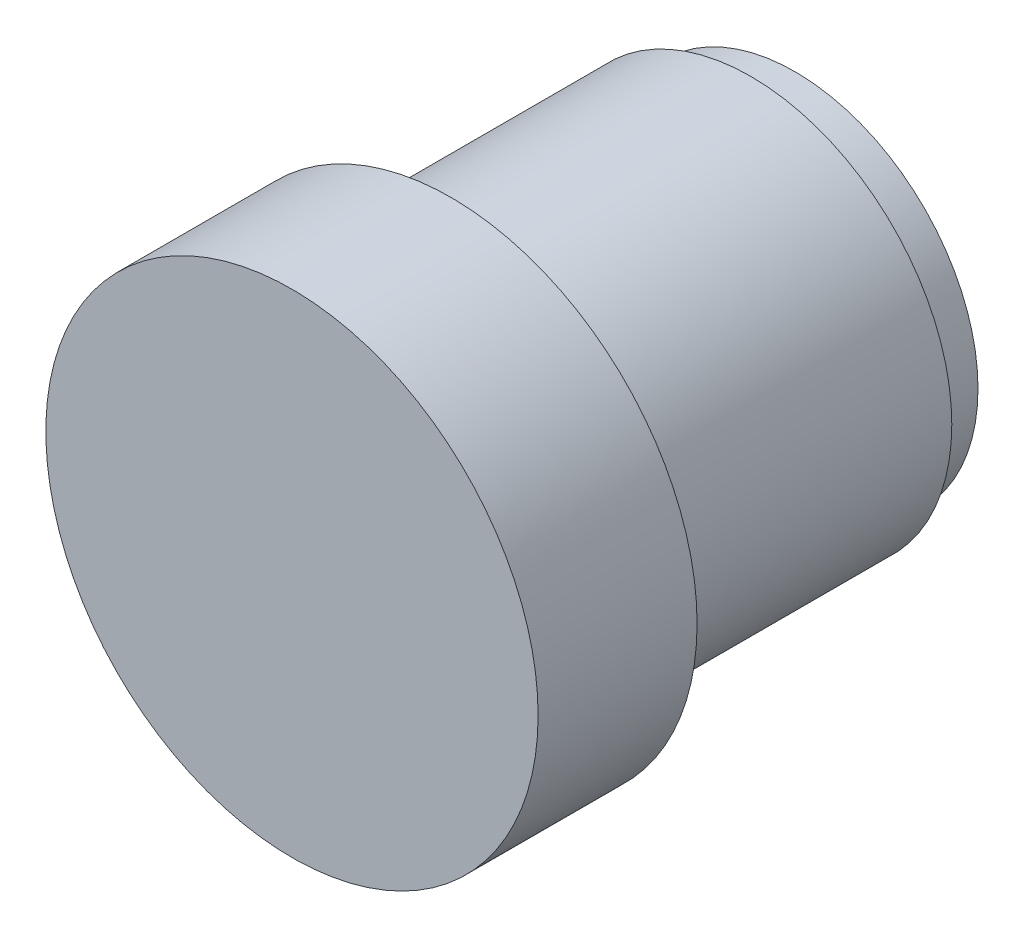
ISO-10303-21;
HEADER;
FILE_DESCRIPTION(('STEP AP214'),'2;1');
FILE_NAME('part.step','',(''),(''),'','','');
FILE_SCHEMA(('AUTOMOTIVE_DESIGN { 1 0 10303 214 1 1 1 1 }'));
ENDSEC;
DATA;
#1=APPLICATION_CONTEXT('core data for automotive mechanical design processes');
#2=APPLICATION_PROTOCOL_DEFINITION('international standard','automotive_design',2000,#1);
#3=PRODUCT_CONTEXT('',#1,'mechanical');
#4=PRODUCT('Part','Part','',(#3));
#5=PRODUCT_RELATED_PRODUCT_CATEGORY('part','',(#4));
#6=PRODUCT_DEFINITION_FORMATION('','',#4);
#7=PRODUCT_DEFINITION_CONTEXT('part definition',#1,'design');
#8=PRODUCT_DEFINITION('design','',#6,#7);
#9=PRODUCT_DEFINITION_SHAPE('','',#8);
#10=(LENGTH_UNIT() NAMED_UNIT(*) SI_UNIT(.MILLI.,.METRE.));
#11=(NAMED_UNIT(*) PLANE_ANGLE_UNIT() SI_UNIT($,.RADIAN.));
#12=(NAMED_UNIT(*) SI_UNIT($,.STERADIAN.) SOLID_ANGLE_UNIT());
#13=UNCERTAINTY_MEASURE_WITH_UNIT(LENGTH_MEASURE(1.E-05),#10,'distance_accuracy_value','');
#14=(GEOMETRIC_REPRESENTATION_CONTEXT(3) GLOBAL_UNCERTAINTY_ASSIGNED_CONTEXT((#13)) GLOBAL_UNIT_ASSIGNED_CONTEXT((#10,
#11,#12)) REPRESENTATION_CONTEXT('',''));
#15=CARTESIAN_POINT('',(0.,0.,0.));
#16=DIRECTION('',(0.,0.,1.));
#17=DIRECTION('',(1.,0.,0.));
#18=AXIS2_PLACEMENT_3D('',#15,#16,#17);
#19=CARTESIAN_POINT('',(0.,0.,4.9));
#20=DIRECTION('',(0.,0.,-1.));
#21=DIRECTION('',(-1.,0.,0.));
#22=AXIS2_PLACEMENT_3D('',#19,#20,#21);
#23=CYLINDRICAL_SURFACE('',#22,20.25);
#24=CARTESIAN_POINT('',(0.,0.,4.9));
#25=DIRECTION('',(0.,0.,1.));
#26=DIRECTION('',(1.,0.,0.));
#27=AXIS2_PLACEMENT_3D('',#24,#25,#26);
#28=CIRCLE('',#27,20.25);
#29=CARTESIAN_POINT('',(20.25,0.,4.9));
#30=VERTEX_POINT('',#29);
#31=EDGE_CURVE('E10',#30,#30,#28,.T.);
#32=ORIENTED_EDGE('',*,*,#31,.F.);
#33=EDGE_LOOP('',(#32));
#34=FACE_BOUND('',#33,.T.);
#35=CARTESIAN_POINT('',(0.,0.,0.));
#36=DIRECTION('',(0.,0.,1.));
#37=DIRECTION('',(1.,0.,0.));
#38=AXIS2_PLACEMENT_3D('',#35,#36,#37);
#39=CIRCLE('',#38,20.25);
#40=CARTESIAN_POINT('',(20.25,0.,0.));
#41=VERTEX_POINT('',#40);
#42=EDGE_CURVE('E35',#41,#41,#39,.T.);
#43=ORIENTED_EDGE('',*,*,#42,.T.);
#44=EDGE_LOOP('',(#43));
#45=FACE_BOUND('',#44,.T.);
#46=ADVANCED_FACE('F32',(#34,#45),#23,.T.);
#47=CARTESIAN_POINT('',(0.,0.,0.));
#48=DIRECTION('',(0.,0.,1.));
#49=DIRECTION('',(1.,0.,0.));
#50=AXIS2_PLACEMENT_3D('',#47,#48,#49);
#51=PLANE('',#50);
#52=CARTESIAN_POINT('',(0.,0.,0.));
#53=DIRECTION('',(0.,0.,-1.));
#54=DIRECTION('',(-1.,0.,0.));
#55=AXIS2_PLACEMENT_3D('',#52,#53,#54);
#56=CIRCLE('',#55,19.25);
#57=CARTESIAN_POINT('',(-19.25,0.,0.));
#58=VERTEX_POINT('',#57);
#59=EDGE_CURVE('E47',#58,#58,#56,.T.);
#60=ORIENTED_EDGE('',*,*,#59,.F.);
#61=EDGE_LOOP('',(#60));
#62=FACE_BOUND('',#61,.T.);
#63=ORIENTED_EDGE('',*,*,#42,.F.);
#64=EDGE_LOOP('',(#63));
#65=FACE_BOUND('',#64,.T.);
#66=ADVANCED_FACE('F86',(#62,#65),#51,.F.);
#67=CARTESIAN_POINT('',(0.,0.,4.9));
#68=DIRECTION('',(0.,0.,1.));
#69=DIRECTION('',(1.,0.,0.));
#70=AXIS2_PLACEMENT_3D('',#67,#68,#69);
#71=PLANE('',#70);
#72=CARTESIAN_POINT('',(0.,0.,4.9));
#73=DIRECTION('',(0.,0.,1.));
#74=DIRECTION('',(1.,0.,0.));
#75=AXIS2_PLACEMENT_3D('',#72,#73,#74);
#76=CIRCLE('',#75,22.25);
#77=CARTESIAN_POINT('',(-22.25,0.,4.9));
#78=VERTEX_POINT('',#77);
#79=EDGE_CURVE('E44',#78,#78,#76,.T.);
#80=ORIENTED_EDGE('',*,*,#79,.F.);
#81=EDGE_LOOP('',(#80));
#82=FACE_BOUND('',#81,.T.);
#83=ORIENTED_EDGE('',*,*,#31,.T.);
#84=EDGE_LOOP('',(#83));
#85=FACE_BOUND('',#84,.T.);
#86=ADVANCED_FACE('F81',(#82,#85),#71,.F.);
#87=CARTESIAN_POINT('',(0.,0.,38.1));
#88=DIRECTION('',(0.,0.,-1.));
#89=DIRECTION('',(-1.,0.,0.));
#90=AXIS2_PLACEMENT_3D('',#87,#88,#89);
#91=CYLINDRICAL_SURFACE('',#90,22.25);
#92=CARTESIAN_POINT('',(0.,0.,38.1));
#93=DIRECTION('',(0.,0.,1.));
#94=DIRECTION('',(1.,0.,0.));
#95=AXIS2_PLACEMENT_3D('',#92,#93,#94);
#96=CIRCLE('',#95,22.25);
#97=CARTESIAN_POINT('',(-22.25,0.,38.1));
#98=VERTEX_POINT('',#97);
#99=EDGE_CURVE('E42',#98,#98,#96,.T.);
#100=CARTESIAN_POINT('',(-22.25,0.,38.1));
#101=CARTESIAN_POINT('',(-22.25,0.,37.7541666666667));
#102=CARTESIAN_POINT('',(-22.25,0.,37.4083333333333));
#103=CARTESIAN_POINT('',(-22.25,0.,36.7166666666667));
#104=CARTESIAN_POINT('',(-22.25,0.,36.3708333333333));
#105=CARTESIAN_POINT('',(-22.25,0.,35.6791666666667));
#106=CARTESIAN_POINT('',(-22.25,0.,35.3333333333333));
#107=CARTESIAN_POINT('',(-22.25,0.,34.6416666666667));
#108=CARTESIAN_POINT('',(-22.25,0.,34.2958333333333));
#109=CARTESIAN_POINT('',(-22.25,0.,33.6041666666667));
#110=CARTESIAN_POINT('',(-22.25,0.,33.2583333333333));
#111=CARTESIAN_POINT('',(-22.25,0.,32.5666666666667));
#112=CARTESIAN_POINT('',(-22.25,0.,32.2208333333333));
#113=CARTESIAN_POINT('',(-22.25,0.,31.5291666666667));
#114=CARTESIAN_POINT('',(-22.25,0.,31.1833333333333));
#115=CARTESIAN_POINT('',(-22.25,0.,30.4916666666667));
#116=CARTESIAN_POINT('',(-22.25,0.,30.1458333333333));
#117=CARTESIAN_POINT('',(-22.25,0.,29.4541666666667));
#118=CARTESIAN_POINT('',(-22.25,0.,29.1083333333333));
#119=CARTESIAN_POINT('',(-22.25,0.,28.4166666666667));
#120=CARTESIAN_POINT('',(-22.25,0.,28.0708333333333));
#121=CARTESIAN_POINT('',(-22.25,0.,27.3791666666667));
#122=CARTESIAN_POINT('',(-22.25,0.,27.0333333333333));
#123=CARTESIAN_POINT('',(-22.25,0.,26.3416666666667));
#124=CARTESIAN_POINT('',(-22.25,0.,25.9958333333333));
#125=CARTESIAN_POINT('',(-22.25,0.,25.3041666666667));
#126=CARTESIAN_POINT('',(-22.25,0.,24.9583333333333));
#127=CARTESIAN_POINT('',(-22.25,0.,24.2666666666667));
#128=CARTESIAN_POINT('',(-22.25,0.,23.9208333333333));
#129=CARTESIAN_POINT('',(-22.25,0.,23.2291666666667));
#130=CARTESIAN_POINT('',(-22.25,0.,22.8833333333333));
#131=CARTESIAN_POINT('',(-22.25,0.,22.1916666666667));
#132=CARTESIAN_POINT('',(-22.25,0.,21.8458333333333));
#133=CARTESIAN_POINT('',(-22.25,0.,21.1541666666667));
#134=CARTESIAN_POINT('',(-22.25,0.,20.8083333333333));
#135=CARTESIAN_POINT('',(-22.25,0.,20.1166666666667));
#136=CARTESIAN_POINT('',(-22.25,0.,19.7708333333333));
#137=CARTESIAN_POINT('',(-22.25,0.,19.0791666666667));
#138=CARTESIAN_POINT('',(-22.25,0.,18.7333333333333));
#139=CARTESIAN_POINT('',(-22.25,0.,18.0416666666667));
#140=CARTESIAN_POINT('',(-22.25,0.,17.6958333333333));
#141=CARTESIAN_POINT('',(-22.25,0.,17.0041666666667));
#142=CARTESIAN_POINT('',(-22.25,0.,16.6583333333333));
#143=CARTESIAN_POINT('',(-22.25,0.,15.9666666666667));
#144=CARTESIAN_POINT('',(-22.25,0.,15.6208333333333));
#145=CARTESIAN_POINT('',(-22.25,0.,14.9291666666667));
#146=CARTESIAN_POINT('',(-22.25,0.,14.5833333333333));
#147=CARTESIAN_POINT('',(-22.25,0.,13.8916666666667));
#148=CARTESIAN_POINT('',(-22.25,0.,13.5458333333333));
#149=CARTESIAN_POINT('',(-22.25,0.,12.8541666666667));
#150=CARTESIAN_POINT('',(-22.25,0.,12.5083333333333));
#151=CARTESIAN_POINT('',(-22.25,0.,11.8166666666667));
#152=CARTESIAN_POINT('',(-22.25,0.,11.4708333333333));
#153=CARTESIAN_POINT('',(-22.25,0.,10.7791666666667));
#154=CARTESIAN_POINT('',(-22.25,0.,10.4333333333333));
#155=CARTESIAN_POINT('',(-22.25,0.,9.74166666666667));
#156=CARTESIAN_POINT('',(-22.25,0.,9.39583333333334));
#157=CARTESIAN_POINT('',(-22.25,0.,8.70416666666667));
#158=CARTESIAN_POINT('',(-22.25,0.,8.35833333333334));
#159=CARTESIAN_POINT('',(-22.25,0.,7.66666666666667));
#160=CARTESIAN_POINT('',(-22.25,0.,7.32083333333334));
#161=CARTESIAN_POINT('',(-22.25,0.,6.62916666666667));
#162=CARTESIAN_POINT('',(-22.25,0.,6.28333333333333));
#163=CARTESIAN_POINT('',(-22.25,0.,5.59166666666667));
#164=CARTESIAN_POINT('',(-22.25,0.,5.24583333333333));
#165=CARTESIAN_POINT('',(-22.25,0.,4.9));
#166=B_SPLINE_CURVE_WITH_KNOTS('',3,(#100,#101,#102,#103,#104,#105,#106,#107,#108,#109,#110,
#111,#112,#113,#114,#115,#116,#117,#118,#119,#120,#121,#122,#123,#124,#125,#126,#127,#128,#129,
#130,#131,#132,#133,#134,#135,#136,#137,#138,#139,#140,#141,#142,#143,#144,#145,#146,#147,#148,
#149,#150,#151,#152,#153,#154,#155,#156,#157,#158,#159,#160,#161,#162,#163,#164,#165),
.UNSPECIFIED.,.F.,.F.,(4,2,2,2,2,2,2,2,2,2,2,2,2,2,2,2,2,2,2,2,2,2,2,2,2,2,2,2,2,2,2,2,4),(0.,
1.0375,2.07499999999999,3.1125,4.14999999999999,5.1875,6.22499999999999,7.26249999999999,8.3,
9.3375,10.375,11.4125,12.45,13.4875,14.525,15.5625,16.6,17.6375,18.675,19.7125,20.75,21.7875,
22.825,23.8625,24.9,25.9375,26.975,28.0125,29.05,30.0875,31.125,32.1625,33.2),.UNSPECIFIED.);
#167=EDGE_CURVE('BSEAM77',#98,#78,#166,.T.);
#168=ORIENTED_EDGE('',*,*,#99,.F.);
#169=ORIENTED_EDGE('',*,*,#79,.T.);
#170=ORIENTED_EDGE('',*,*,#167,.T.);
#171=ORIENTED_EDGE('',*,*,#167,.F.);
#172=EDGE_LOOP('',(#168,#170,#169,#171));
#173=FACE_BOUND('',#172,.T.);
#174=ADVANCED_FACE('F77',(#173),#91,.T.);
#175=CARTESIAN_POINT('',(0.,0.,58.2));
#176=DIRECTION('',(0.,0.,-1.));
#177=DIRECTION('',(-1.,0.,0.));
#178=AXIS2_PLACEMENT_3D('',#175,#176,#177);
#179=CYLINDRICAL_SURFACE('',#178,19.25);
#180=CARTESIAN_POINT('',(0.,0.,38.1));
#181=DIRECTION('',(0.,0.,1.));
#182=DIRECTION('',(1.,0.,0.));
#183=AXIS2_PLACEMENT_3D('',#180,#181,#182);
#184=CIRCLE('',#183,19.25);
#185=CARTESIAN_POINT('',(-19.25,0.,38.1));
#186=VERTEX_POINT('',#185);
#187=EDGE_CURVE('E52',#186,#186,#184,.F.);
#188=CARTESIAN_POINT('',(-19.25,0.,38.1));
#189=CARTESIAN_POINT('',(-19.25,0.,37.703125));
#190=CARTESIAN_POINT('',(-19.25,0.,37.30625));
#191=CARTESIAN_POINT('',(-19.25,0.,36.5125));
#192=CARTESIAN_POINT('',(-19.25,0.,36.115625));
#193=CARTESIAN_POINT('',(-19.25,0.,35.321875));
#194=CARTESIAN_POINT('',(-19.25,0.,34.925));
#195=CARTESIAN_POINT('',(-19.25,0.,34.13125));
#196=CARTESIAN_POINT('',(-19.25,0.,33.734375));
#197=CARTESIAN_POINT('',(-19.25,0.,32.940625));
#198=CARTESIAN_POINT('',(-19.25,0.,32.54375));
#199=CARTESIAN_POINT('',(-19.25,0.,31.75));
#200=CARTESIAN_POINT('',(-19.25,0.,31.353125));
#201=CARTESIAN_POINT('',(-19.25,0.,30.559375));
#202=CARTESIAN_POINT('',(-19.25,0.,30.1625));
#203=CARTESIAN_POINT('',(-19.25,0.,29.36875));
#204=CARTESIAN_POINT('',(-19.25,0.,28.971875));
#205=CARTESIAN_POINT('',(-19.25,0.,28.178125));
#206=CARTESIAN_POINT('',(-19.25,0.,27.78125));
#207=CARTESIAN_POINT('',(-19.25,0.,26.9875));
#208=CARTESIAN_POINT('',(-19.25,0.,26.590625));
#209=CARTESIAN_POINT('',(-19.25,0.,25.796875));
#210=CARTESIAN_POINT('',(-19.25,0.,25.4));
#211=CARTESIAN_POINT('',(-19.25,0.,24.60625));
#212=CARTESIAN_POINT('',(-19.25,0.,24.209375));
#213=CARTESIAN_POINT('',(-19.25,0.,23.415625));
#214=CARTESIAN_POINT('',(-19.25,0.,23.01875));
#215=CARTESIAN_POINT('',(-19.25,0.,22.225));
#216=CARTESIAN_POINT('',(-19.25,0.,21.828125));
#217=CARTESIAN_POINT('',(-19.25,0.,21.034375));
#218=CARTESIAN_POINT('',(-19.25,0.,20.6375));
#219=CARTESIAN_POINT('',(-19.25,0.,19.84375));
#220=CARTESIAN_POINT('',(-19.25,0.,19.446875));
#221=CARTESIAN_POINT('',(-19.25,0.,18.653125));
#222=CARTESIAN_POINT('',(-19.25,0.,18.25625));
#223=CARTESIAN_POINT('',(-19.25,0.,17.4625));
#224=CARTESIAN_POINT('',(-19.25,0.,17.065625));
#225=CARTESIAN_POINT('',(-19.25,0.,16.271875));
#226=CARTESIAN_POINT('',(-19.25,0.,15.875));
#227=CARTESIAN_POINT('',(-19.25,0.,15.08125));
#228=CARTESIAN_POINT('',(-19.25,0.,14.684375));
#229=CARTESIAN_POINT('',(-19.25,0.,13.890625));
#230=CARTESIAN_POINT('',(-19.25,0.,13.49375));
#231=CARTESIAN_POINT('',(-19.25,0.,12.7));
#232=CARTESIAN_POINT('',(-19.25,0.,12.303125));
#233=CARTESIAN_POINT('',(-19.25,0.,11.509375));
#234=CARTESIAN_POINT('',(-19.25,0.,11.1125));
#235=CARTESIAN_POINT('',(-19.25,0.,10.31875));
#236=CARTESIAN_POINT('',(-19.25,0.,9.921875));
#237=CARTESIAN_POINT('',(-19.25,0.,9.128125));
#238=CARTESIAN_POINT('',(-19.25,0.,8.73125));
#239=CARTESIAN_POINT('',(-19.25,0.,7.93750000000001));
#240=CARTESIAN_POINT('',(-19.25,0.,7.540625));
#241=CARTESIAN_POINT('',(-19.25,0.,6.746875));
#242=CARTESIAN_POINT('',(-19.25,0.,6.35));
#243=CARTESIAN_POINT('',(-19.25,0.,5.55625));
#244=CARTESIAN_POINT('',(-19.25,0.,5.159375));
#245=CARTESIAN_POINT('',(-19.25,0.,4.365625));
#246=CARTESIAN_POINT('',(-19.25,0.,3.96875));
#247=CARTESIAN_POINT('',(-19.25,0.,3.175));
#248=CARTESIAN_POINT('',(-19.25,0.,2.778125));
#249=CARTESIAN_POINT('',(-19.25,0.,1.984375));
#250=CARTESIAN_POINT('',(-19.25,0.,1.5875));
#251=CARTESIAN_POINT('',(-19.25,0.,0.79375));
#252=CARTESIAN_POINT('',(-19.25,0.,0.396875));
#253=CARTESIAN_POINT('',(-19.25,0.,0.));
#254=B_SPLINE_CURVE_WITH_KNOTS('',3,(#188,#189,#190,#191,#192,#193,#194,#195,#196,#197,#198,
#199,#200,#201,#202,#203,#204,#205,#206,#207,#208,#209,#210,#211,#212,#213,#214,#215,#216,#217,
#218,#219,#220,#221,#222,#223,#224,#225,#226,#227,#228,#229,#230,#231,#232,#233,#234,#235,#236,
#237,#238,#239,#240,#241,#242,#243,#244,#245,#246,#247,#248,#249,#250,#251,#252,#253),
.UNSPECIFIED.,.F.,.F.,(4,2,2,2,2,2,2,2,2,2,2,2,2,2,2,2,2,2,2,2,2,2,2,2,2,2,2,2,2,2,2,2,4),(0.,
1.190625,2.38125,3.571875,4.7625,5.953125,7.14375,8.33437499999999,9.525,10.715625,11.90625,
13.096875,14.2875,15.478125,16.66875,17.859375,19.05,20.240625,21.43125,22.621875,23.8125,
25.003125,26.19375,27.384375,28.575,29.765625,30.95625,32.146875,33.3375,34.528125,35.71875,
36.909375,38.1),.UNSPECIFIED.);
#255=EDGE_CURVE('BSEAM80',#186,#58,#254,.T.);
#256=ORIENTED_EDGE('',*,*,#187,.F.);
#257=ORIENTED_EDGE('',*,*,#59,.T.);
#258=ORIENTED_EDGE('',*,*,#255,.T.);
#259=ORIENTED_EDGE('',*,*,#255,.F.);
#260=EDGE_LOOP('',(#256,#258,#257,#259));
#261=FACE_BOUND('',#260,.T.);
#262=ADVANCED_FACE('F80',(#261),#179,.F.);
#263=CARTESIAN_POINT('',(0.,0.,38.1));
#264=DIRECTION('',(0.,0.,1.));
#265=DIRECTION('',(1.,0.,0.));
#266=AXIS2_PLACEMENT_3D('',#263,#264,#265);
#267=PLANE('',#266);
#268=ORIENTED_EDGE('',*,*,#187,.T.);
#269=EDGE_LOOP('',(#268));
#270=FACE_BOUND('',#269,.T.);
#271=ADVANCED_FACE('F73',(#270),#267,.F.);
#272=CARTESIAN_POINT('',(0.,0.,38.1));
#273=DIRECTION('',(0.,0.,1.));
#274=DIRECTION('',(1.,0.,0.));
#275=AXIS2_PLACEMENT_3D('',#272,#273,#274);
#276=CIRCLE('',#275,27.25);
#277=CARTESIAN_POINT('',(27.25,0.,38.1));
#278=VERTEX_POINT('',#277);
#279=EDGE_CURVE('E56',#278,#278,#276,.T.);
#280=ORIENTED_EDGE('',*,*,#279,.F.);
#281=EDGE_LOOP('',(#280));
#282=FACE_BOUND('',#281,.T.);
#283=ORIENTED_EDGE('',*,*,#99,.T.);
#284=EDGE_LOOP('',(#283));
#285=FACE_BOUND('',#284,.T.);
#286=ADVANCED_FACE('F67',(#282,#285),#267,.F.);
#287=CARTESIAN_POINT('',(0.,0.,55.7));
#288=DIRECTION('',(0.,0.,-1.));
#289=DIRECTION('',(-1.,0.,0.));
#290=AXIS2_PLACEMENT_3D('',#287,#288,#289);
#291=CYLINDRICAL_SURFACE('',#290,27.25);
#292=CARTESIAN_POINT('',(0.,0.,55.7));
#293=DIRECTION('',(0.,0.,1.));
#294=DIRECTION('',(1.,0.,0.));
#295=AXIS2_PLACEMENT_3D('',#292,#293,#294);
#296=CIRCLE('',#295,27.25);
#297=CARTESIAN_POINT('',(27.25,0.,55.7));
#298=VERTEX_POINT('',#297);
#299=EDGE_CURVE('E55',#298,#298,#296,.T.);
#300=ORIENTED_EDGE('',*,*,#299,.F.);
#301=EDGE_LOOP('',(#300));
#302=FACE_BOUND('',#301,.T.);
#303=ORIENTED_EDGE('',*,*,#279,.T.);
#304=EDGE_LOOP('',(#303));
#305=FACE_BOUND('',#304,.T.);
#306=ADVANCED_FACE('F64',(#302,#305),#291,.T.);
#307=CARTESIAN_POINT('',(0.,0.,55.7));
#308=DIRECTION('',(0.,0.,1.));
#309=DIRECTION('',(1.,0.,0.));
#310=AXIS2_PLACEMENT_3D('',#307,#308,#309);
#311=PLANE('',#310);
#312=ORIENTED_EDGE('',*,*,#299,.T.);
#313=EDGE_LOOP('',(#312));
#314=FACE_BOUND('',#313,.T.);
#315=ADVANCED_FACE('F62',(#314),#311,.T.);
#316=CLOSED_SHELL('',(#46,#66,#86,#174,#262,#271,#286,#306,#315));
#317=MANIFOLD_SOLID_BREP('B2',#316);
#318=ADVANCED_BREP_SHAPE_REPRESENTATION('',(#18,#317),#14);
#319=SHAPE_DEFINITION_REPRESENTATION(#9,#318);
ENDSEC;
END-ISO-10303-21;
